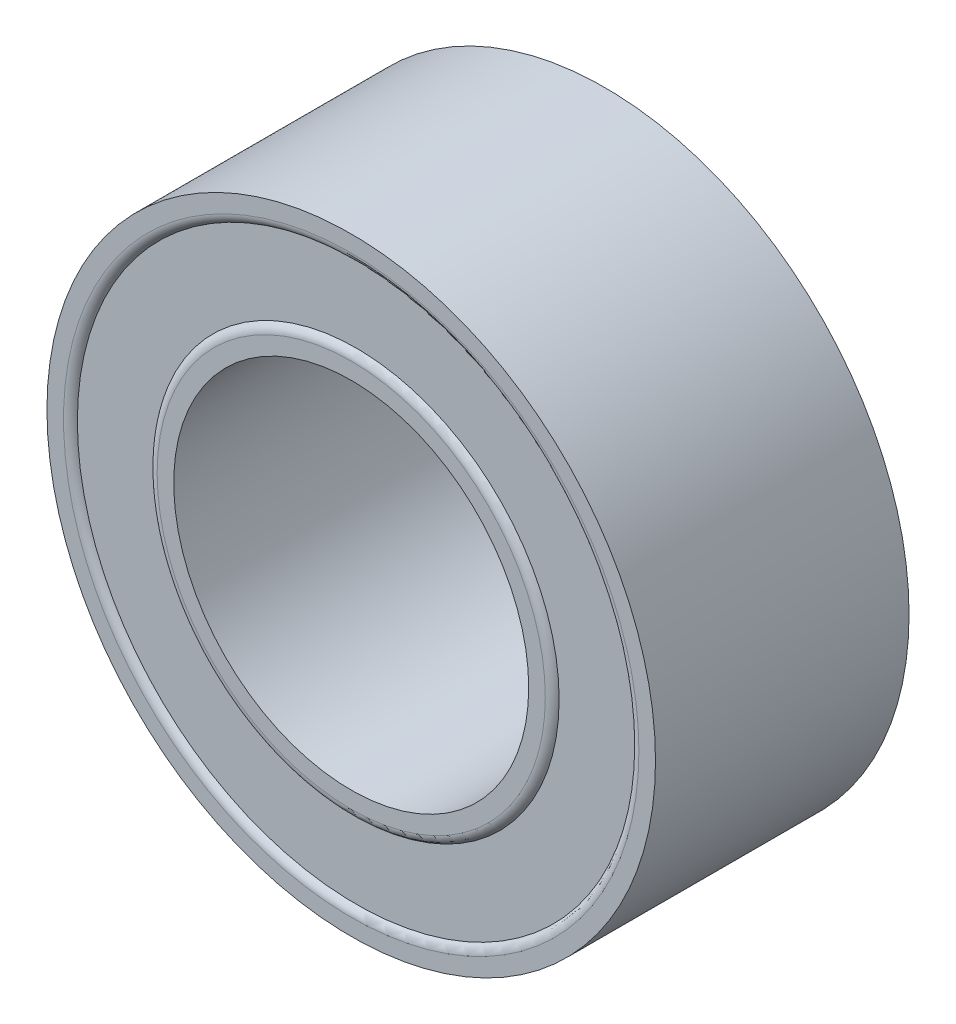
ISO-10303-21;
HEADER;
FILE_DESCRIPTION(('STEP AP214'),'2;1');
FILE_NAME('part.step','',(''),(''),'','','');
FILE_SCHEMA(('AUTOMOTIVE_DESIGN { 1 0 10303 214 1 1 1 1 }'));
ENDSEC;
DATA;
#1=APPLICATION_CONTEXT('core data for automotive mechanical design processes');
#2=APPLICATION_PROTOCOL_DEFINITION('international standard','automotive_design',2000,#1);
#3=PRODUCT_CONTEXT('',#1,'mechanical');
#4=PRODUCT('Part','Part','',(#3));
#5=PRODUCT_RELATED_PRODUCT_CATEGORY('part','',(#4));
#6=PRODUCT_DEFINITION_FORMATION('','',#4);
#7=PRODUCT_DEFINITION_CONTEXT('part definition',#1,'design');
#8=PRODUCT_DEFINITION('design','',#6,#7);
#9=PRODUCT_DEFINITION_SHAPE('','',#8);
#10=(LENGTH_UNIT() NAMED_UNIT(*) SI_UNIT(.MILLI.,.METRE.));
#11=(NAMED_UNIT(*) PLANE_ANGLE_UNIT() SI_UNIT($,.RADIAN.));
#12=(NAMED_UNIT(*) SI_UNIT($,.STERADIAN.) SOLID_ANGLE_UNIT());
#13=UNCERTAINTY_MEASURE_WITH_UNIT(LENGTH_MEASURE(1.E-05),#10,'distance_accuracy_value','');
#14=(GEOMETRIC_REPRESENTATION_CONTEXT(3) GLOBAL_UNCERTAINTY_ASSIGNED_CONTEXT((#13)) GLOBAL_UNIT_ASSIGNED_CONTEXT((#10,
#11,#12)) REPRESENTATION_CONTEXT('',''));
#15=CARTESIAN_POINT('',(0.,0.,0.));
#16=DIRECTION('',(0.,0.,1.));
#17=DIRECTION('',(1.,0.,0.));
#18=AXIS2_PLACEMENT_3D('',#15,#16,#17);
#19=CARTESIAN_POINT('',(0.,0.,-2.5));
#20=DIRECTION('',(0.,0.,1.));
#21=DIRECTION('',(1.,0.,0.));
#22=AXIS2_PLACEMENT_3D('',#19,#20,#21);
#23=PLANE('',#22);
#24=CARTESIAN_POINT('',(0.,0.,-2.5));
#25=DIRECTION('',(0.,0.,1.));
#26=DIRECTION('',(1.,0.,0.));
#27=AXIS2_PLACEMENT_3D('',#24,#25,#26);
#28=CIRCLE('',#27,5.67320508075689);
#29=CARTESIAN_POINT('',(5.67320508075689,0.,-2.5));
#30=VERTEX_POINT('',#29);
#31=EDGE_CURVE('E48',#30,#30,#28,.T.);
#32=ORIENTED_EDGE('',*,*,#31,.T.);
#33=EDGE_LOOP('',(#32));
#34=FACE_BOUND('',#33,.T.);
#35=CARTESIAN_POINT('',(0.,0.,-2.5));
#36=DIRECTION('',(0.,0.,1.));
#37=DIRECTION('',(1.,0.,0.));
#38=AXIS2_PLACEMENT_3D('',#35,#36,#37);
#39=CIRCLE('',#38,6.);
#40=CARTESIAN_POINT('',(6.,0.,-2.5));
#41=VERTEX_POINT('',#40);
#42=EDGE_CURVE('E54',#41,#41,#39,.T.);
#43=ORIENTED_EDGE('',*,*,#42,.F.);
#44=EDGE_LOOP('',(#43));
#45=FACE_BOUND('',#44,.T.);
#46=ADVANCED_FACE('F33',(#34,#45),#23,.F.);
#47=CARTESIAN_POINT('',(0.,0.,2.5));
#48=DIRECTION('',(0.,0.,1.));
#49=DIRECTION('',(1.,0.,0.));
#50=AXIS2_PLACEMENT_3D('',#47,#48,#49);
#51=PLANE('',#50);
#52=CARTESIAN_POINT('',(0.,0.,2.5));
#53=DIRECTION('',(0.,0.,1.));
#54=DIRECTION('',(1.,0.,0.));
#55=AXIS2_PLACEMENT_3D('',#52,#53,#54);
#56=CIRCLE('',#55,3.82679491924311);
#57=CARTESIAN_POINT('',(3.82679491924311,0.,2.5));
#58=VERTEX_POINT('',#57);
#59=EDGE_CURVE('E10',#58,#58,#56,.T.);
#60=ORIENTED_EDGE('',*,*,#59,.T.);
#61=EDGE_LOOP('',(#60));
#62=FACE_BOUND('',#61,.T.);
#63=CARTESIAN_POINT('',(0.,0.,2.5));
#64=DIRECTION('',(0.,0.,1.));
#65=DIRECTION('',(1.,0.,0.));
#66=AXIS2_PLACEMENT_3D('',#63,#64,#65);
#67=CIRCLE('',#66,3.5);
#68=CARTESIAN_POINT('',(3.5,0.,2.5));
#69=VERTEX_POINT('',#68);
#70=EDGE_CURVE('E57',#69,#69,#67,.T.);
#71=ORIENTED_EDGE('',*,*,#70,.F.);
#72=EDGE_LOOP('',(#71));
#73=FACE_BOUND('',#72,.T.);
#74=ADVANCED_FACE('F95',(#62,#73),#51,.T.);
#75=CARTESIAN_POINT('',(0.,0.,2.5));
#76=DIRECTION('',(0.,0.,1.));
#77=DIRECTION('',(1.,0.,0.));
#78=AXIS2_PLACEMENT_3D('',#75,#76,#77);
#79=CIRCLE('',#78,5.67320508075689);
#80=CARTESIAN_POINT('',(5.67320508075689,0.,2.5));
#81=VERTEX_POINT('',#80);
#82=EDGE_CURVE('E40',#81,#81,#79,.F.);
#83=ORIENTED_EDGE('',*,*,#82,.T.);
#84=EDGE_LOOP('',(#83));
#85=FACE_BOUND('',#84,.T.);
#86=CARTESIAN_POINT('',(0.,0.,2.5));
#87=DIRECTION('',(0.,0.,1.));
#88=DIRECTION('',(1.,0.,0.));
#89=AXIS2_PLACEMENT_3D('',#86,#87,#88);
#90=CIRCLE('',#89,6.);
#91=CARTESIAN_POINT('',(6.,0.,2.5));
#92=VERTEX_POINT('',#91);
#93=EDGE_CURVE('E53',#92,#92,#90,.T.);
#94=ORIENTED_EDGE('',*,*,#93,.T.);
#95=EDGE_LOOP('',(#94));
#96=FACE_BOUND('',#95,.T.);
#97=ADVANCED_FACE('F102',(#85,#96),#51,.T.);
#98=CARTESIAN_POINT('',(0.,0.,-2.5));
#99=DIRECTION('',(0.,0.,1.));
#100=DIRECTION('',(1.,0.,0.));
#101=AXIS2_PLACEMENT_3D('',#98,#99,#100);
#102=CIRCLE('',#101,3.82679491924311);
#103=CARTESIAN_POINT('',(3.82679491924311,0.,-2.5));
#104=VERTEX_POINT('',#103);
#105=EDGE_CURVE('E44',#104,#104,#102,.F.);
#106=ORIENTED_EDGE('',*,*,#105,.T.);
#107=EDGE_LOOP('',(#106));
#108=FACE_BOUND('',#107,.T.);
#109=CARTESIAN_POINT('',(0.,0.,-2.5));
#110=DIRECTION('',(0.,0.,1.));
#111=DIRECTION('',(1.,0.,0.));
#112=AXIS2_PLACEMENT_3D('',#109,#110,#111);
#113=CIRCLE('',#112,3.5);
#114=CARTESIAN_POINT('',(3.5,0.,-2.5));
#115=VERTEX_POINT('',#114);
#116=EDGE_CURVE('E60',#115,#115,#113,.T.);
#117=ORIENTED_EDGE('',*,*,#116,.T.);
#118=EDGE_LOOP('',(#117));
#119=FACE_BOUND('',#118,.T.);
#120=ADVANCED_FACE('F98',(#108,#119),#23,.F.);
#121=CARTESIAN_POINT('',(0.,0.,2.5));
#122=DIRECTION('',(0.,0.,-1.));
#123=DIRECTION('',(-1.,0.,0.));
#124=AXIS2_PLACEMENT_3D('',#121,#122,#123);
#125=CYLINDRICAL_SURFACE('',#124,6.);
#126=ORIENTED_EDGE('',*,*,#93,.F.);
#127=EDGE_LOOP('',(#126));
#128=FACE_BOUND('',#127,.T.);
#129=ORIENTED_EDGE('',*,*,#42,.T.);
#130=EDGE_LOOP('',(#129));
#131=FACE_BOUND('',#130,.T.);
#132=ADVANCED_FACE('F107',(#128,#131),#125,.T.);
#133=CARTESIAN_POINT('',(0.,0.,2.5));
#134=DIRECTION('',(0.,0.,-1.));
#135=DIRECTION('',(-1.,0.,0.));
#136=AXIS2_PLACEMENT_3D('',#133,#134,#135);
#137=CYLINDRICAL_SURFACE('',#136,3.5);
#138=ORIENTED_EDGE('',*,*,#70,.T.);
#139=EDGE_LOOP('',(#138));
#140=FACE_BOUND('',#139,.T.);
#141=ORIENTED_EDGE('',*,*,#116,.F.);
#142=EDGE_LOOP('',(#141));
#143=FACE_BOUND('',#142,.T.);
#144=ADVANCED_FACE('F113',(#140,#143),#137,.F.);
#145=CARTESIAN_POINT('',(0.,0.,2.4));
#146=DIRECTION('',(0.,0.,1.));
#147=DIRECTION('',(1.,0.,0.));
#148=AXIS2_PLACEMENT_3D('',#145,#146,#147);
#149=PLANE('',#148);
#150=CARTESIAN_POINT('',(0.,0.,2.4));
#151=DIRECTION('',(0.,0.,1.));
#152=DIRECTION('',(1.,0.,0.));
#153=AXIS2_PLACEMENT_3D('',#150,#151,#152);
#154=CIRCLE('',#153,4.);
#155=CARTESIAN_POINT('',(4.,0.,2.4));
#156=VERTEX_POINT('',#155);
#157=EDGE_CURVE('E68',#156,#156,#154,.T.);
#158=ORIENTED_EDGE('',*,*,#157,.F.);
#159=EDGE_LOOP('',(#158));
#160=FACE_BOUND('',#159,.T.);
#161=CARTESIAN_POINT('',(0.,0.,2.4));
#162=DIRECTION('',(0.,0.,1.));
#163=DIRECTION('',(1.,0.,0.));
#164=AXIS2_PLACEMENT_3D('',#161,#162,#163);
#165=CIRCLE('',#164,5.5);
#166=CARTESIAN_POINT('',(5.5,0.,2.4));
#167=VERTEX_POINT('',#166);
#168=EDGE_CURVE('E63',#167,#167,#165,.T.);
#169=ORIENTED_EDGE('',*,*,#168,.T.);
#170=EDGE_LOOP('',(#169));
#171=FACE_BOUND('',#170,.T.);
#172=ADVANCED_FACE('F119',(#160,#171),#149,.T.);
#173=CARTESIAN_POINT('',(0.,0.,-2.4));
#174=DIRECTION('',(0.,0.,-1.));
#175=DIRECTION('',(1.,0.,0.));
#176=AXIS2_PLACEMENT_3D('',#173,#174,#175);
#177=PLANE('',#176);
#178=CARTESIAN_POINT('',(0.,0.,-2.4));
#179=DIRECTION('',(0.,0.,1.));
#180=DIRECTION('',(1.,0.,0.));
#181=AXIS2_PLACEMENT_3D('',#178,#179,#180);
#182=CIRCLE('',#181,5.5);
#183=CARTESIAN_POINT('',(5.5,0.,-2.4));
#184=VERTEX_POINT('',#183);
#185=EDGE_CURVE('E71',#184,#184,#182,.T.);
#186=ORIENTED_EDGE('',*,*,#185,.F.);
#187=EDGE_LOOP('',(#186));
#188=FACE_BOUND('',#187,.T.);
#189=CARTESIAN_POINT('',(0.,0.,-2.4));
#190=DIRECTION('',(0.,0.,1.));
#191=DIRECTION('',(1.,0.,0.));
#192=AXIS2_PLACEMENT_3D('',#189,#190,#191);
#193=CIRCLE('',#192,4.);
#194=CARTESIAN_POINT('',(4.,0.,-2.4));
#195=VERTEX_POINT('',#194);
#196=EDGE_CURVE('E74',#195,#195,#193,.T.);
#197=ORIENTED_EDGE('',*,*,#196,.T.);
#198=EDGE_LOOP('',(#197));
#199=FACE_BOUND('',#198,.T.);
#200=ADVANCED_FACE('F78',(#188,#199),#177,.T.);
#201=CARTESIAN_POINT('',(0.,0.,-2.3));
#202=DIRECTION('',(0.,0.,1.));
#203=DIRECTION('',(1.,0.,0.));
#204=AXIS2_PLACEMENT_3D('',#201,#202,#203);
#205=TOROIDAL_SURFACE('',#204,5.67320508075689,0.2);
#206=ORIENTED_EDGE('',*,*,#185,.T.);
#207=EDGE_LOOP('',(#206));
#208=FACE_BOUND('',#207,.T.);
#209=ORIENTED_EDGE('',*,*,#31,.F.);
#210=EDGE_LOOP('',(#209));
#211=FACE_BOUND('',#210,.T.);
#212=ADVANCED_FACE('F83',(#208,#211),#205,.T.);
#213=CARTESIAN_POINT('',(0.,0.,-2.3));
#214=DIRECTION('',(0.,0.,-1.));
#215=DIRECTION('',(-1.,0.,0.));
#216=AXIS2_PLACEMENT_3D('',#213,#214,#215);
#217=TOROIDAL_SURFACE('',#216,3.82679491924311,0.2);
#218=ORIENTED_EDGE('',*,*,#105,.F.);
#219=EDGE_LOOP('',(#218));
#220=FACE_BOUND('',#219,.T.);
#221=ORIENTED_EDGE('',*,*,#196,.F.);
#222=EDGE_LOOP('',(#221));
#223=FACE_BOUND('',#222,.T.);
#224=ADVANCED_FACE('F80',(#220,#223),#217,.T.);
#225=CARTESIAN_POINT('',(0.,0.,2.3));
#226=DIRECTION('',(0.,0.,1.));
#227=DIRECTION('',(1.,0.,0.));
#228=AXIS2_PLACEMENT_3D('',#225,#226,#227);
#229=TOROIDAL_SURFACE('',#228,5.67320508075689,0.2);
#230=ORIENTED_EDGE('',*,*,#82,.F.);
#231=EDGE_LOOP('',(#230));
#232=FACE_BOUND('',#231,.T.);
#233=ORIENTED_EDGE('',*,*,#168,.F.);
#234=EDGE_LOOP('',(#233));
#235=FACE_BOUND('',#234,.T.);
#236=ADVANCED_FACE('F82',(#232,#235),#229,.T.);
#237=CARTESIAN_POINT('',(0.,0.,2.3));
#238=DIRECTION('',(0.,0.,-1.));
#239=DIRECTION('',(-1.,0.,0.));
#240=AXIS2_PLACEMENT_3D('',#237,#238,#239);
#241=TOROIDAL_SURFACE('',#240,3.82679491924311,0.2);
#242=ORIENTED_EDGE('',*,*,#157,.T.);
#243=EDGE_LOOP('',(#242));
#244=FACE_BOUND('',#243,.T.);
#245=ORIENTED_EDGE('',*,*,#59,.F.);
#246=EDGE_LOOP('',(#245));
#247=FACE_BOUND('',#246,.T.);
#248=ADVANCED_FACE('F35',(#244,#247),#241,.T.);
#249=CLOSED_SHELL('',(#46,#74,#97,#120,#132,#144,#172,#200,#212,#224,#236,#248));
#250=MANIFOLD_SOLID_BREP('B2',#249);
#251=ADVANCED_BREP_SHAPE_REPRESENTATION('',(#18,#250),#14);
#252=SHAPE_DEFINITION_REPRESENTATION(#9,#251);
ENDSEC;
END-ISO-10303-21;
